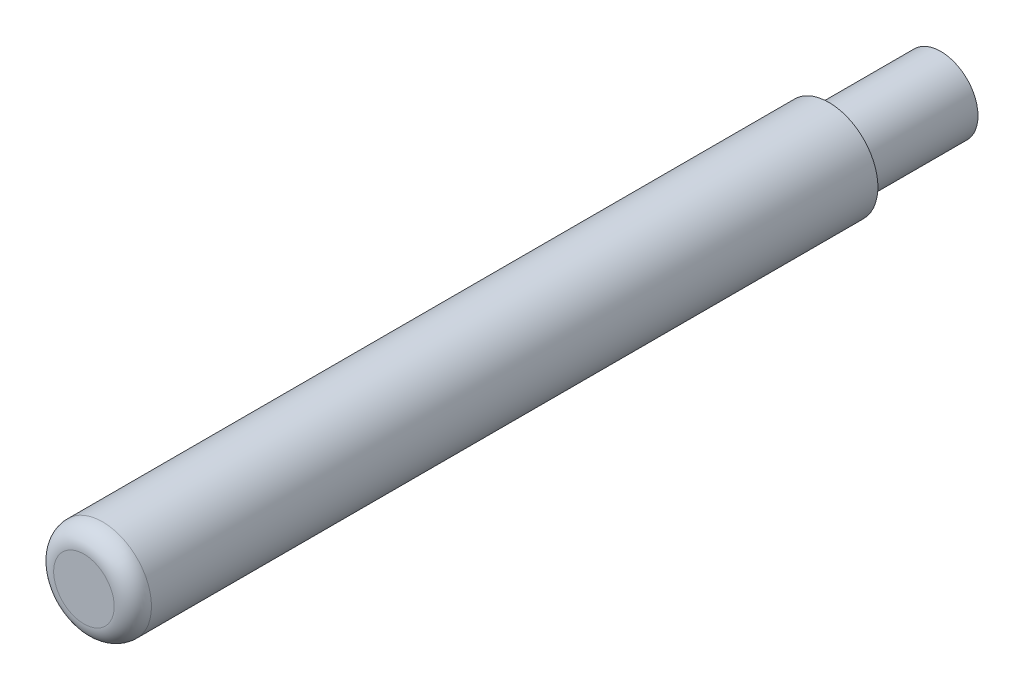
ISO-10303-21;
HEADER;
FILE_DESCRIPTION(('STEP AP214'),'2;1');
FILE_NAME('part.step','',(''),(''),'','','');
FILE_SCHEMA(('AUTOMOTIVE_DESIGN { 1 0 10303 214 1 1 1 1 }'));
ENDSEC;
DATA;
#1=APPLICATION_CONTEXT('core data for automotive mechanical design processes');
#2=APPLICATION_PROTOCOL_DEFINITION('international standard','automotive_design',2000,#1);
#3=PRODUCT_CONTEXT('',#1,'mechanical');
#4=PRODUCT('Part','Part','',(#3));
#5=PRODUCT_RELATED_PRODUCT_CATEGORY('part','',(#4));
#6=PRODUCT_DEFINITION_FORMATION('','',#4);
#7=PRODUCT_DEFINITION_CONTEXT('part definition',#1,'design');
#8=PRODUCT_DEFINITION('design','',#6,#7);
#9=PRODUCT_DEFINITION_SHAPE('','',#8);
#10=(LENGTH_UNIT() NAMED_UNIT(*) SI_UNIT(.MILLI.,.METRE.));
#11=(NAMED_UNIT(*) PLANE_ANGLE_UNIT() SI_UNIT($,.RADIAN.));
#12=(NAMED_UNIT(*) SI_UNIT($,.STERADIAN.) SOLID_ANGLE_UNIT());
#13=UNCERTAINTY_MEASURE_WITH_UNIT(LENGTH_MEASURE(1.E-05),#10,'distance_accuracy_value','');
#14=(GEOMETRIC_REPRESENTATION_CONTEXT(3) GLOBAL_UNCERTAINTY_ASSIGNED_CONTEXT((#13)) GLOBAL_UNIT_ASSIGNED_CONTEXT((#10,
#11,#12)) REPRESENTATION_CONTEXT('',''));
#15=CARTESIAN_POINT('',(0.,0.,0.));
#16=DIRECTION('',(0.,0.,1.));
#17=DIRECTION('',(1.,0.,0.));
#18=AXIS2_PLACEMENT_3D('',#15,#16,#17);
#19=CARTESIAN_POINT('',(0.,0.,-15.24));
#20=DIRECTION('',(0.,0.,1.));
#21=DIRECTION('',(1.,0.,0.));
#22=AXIS2_PLACEMENT_3D('',#19,#20,#21);
#23=CYLINDRICAL_SURFACE('',#22,5.08);
#24=CARTESIAN_POINT('',(0.,0.,-15.24));
#25=DIRECTION('',(0.,0.,1.));
#26=DIRECTION('',(1.,0.,0.));
#27=AXIS2_PLACEMENT_3D('',#24,#25,#26);
#28=CIRCLE('',#27,5.08);
#29=CARTESIAN_POINT('',(5.08,0.,-15.24));
#30=VERTEX_POINT('',#29);
#31=EDGE_CURVE('E57',#30,#30,#28,.T.);
#32=CARTESIAN_POINT('',(0.,0.,0.));
#33=DIRECTION('',(0.,0.,1.));
#34=DIRECTION('',(1.,0.,0.));
#35=AXIS2_PLACEMENT_3D('',#32,#33,#34);
#36=CIRCLE('',#35,5.08);
#37=CARTESIAN_POINT('',(5.08,0.,0.));
#38=VERTEX_POINT('',#37);
#39=EDGE_CURVE('E61',#38,#38,#36,.T.);
#40=CARTESIAN_POINT('',(5.08,0.,-15.24));
#41=CARTESIAN_POINT('',(5.08,0.,-15.08125));
#42=CARTESIAN_POINT('',(5.08,0.,-14.9225));
#43=CARTESIAN_POINT('',(5.08,0.,-14.605));
#44=CARTESIAN_POINT('',(5.08,0.,-14.44625));
#45=CARTESIAN_POINT('',(5.08,0.,-14.12875));
#46=CARTESIAN_POINT('',(5.08,0.,-13.97));
#47=CARTESIAN_POINT('',(5.08,0.,-13.6525));
#48=CARTESIAN_POINT('',(5.08,0.,-13.49375));
#49=CARTESIAN_POINT('',(5.08,0.,-13.17625));
#50=CARTESIAN_POINT('',(5.08,0.,-13.0175));
#51=CARTESIAN_POINT('',(5.08,0.,-12.7));
#52=CARTESIAN_POINT('',(5.08,0.,-12.54125));
#53=CARTESIAN_POINT('',(5.08,0.,-12.22375));
#54=CARTESIAN_POINT('',(5.08,0.,-12.065));
#55=CARTESIAN_POINT('',(5.08,0.,-11.7475));
#56=CARTESIAN_POINT('',(5.08,0.,-11.58875));
#57=CARTESIAN_POINT('',(5.08,0.,-11.27125));
#58=CARTESIAN_POINT('',(5.08,0.,-11.1125));
#59=CARTESIAN_POINT('',(5.08,0.,-10.795));
#60=CARTESIAN_POINT('',(5.08,0.,-10.63625));
#61=CARTESIAN_POINT('',(5.08,0.,-10.31875));
#62=CARTESIAN_POINT('',(5.08,0.,-10.16));
#63=CARTESIAN_POINT('',(5.08,0.,-9.8425));
#64=CARTESIAN_POINT('',(5.08,0.,-9.68375));
#65=CARTESIAN_POINT('',(5.08,0.,-9.36625));
#66=CARTESIAN_POINT('',(5.08,0.,-9.2075));
#67=CARTESIAN_POINT('',(5.08,0.,-8.89));
#68=CARTESIAN_POINT('',(5.08,0.,-8.73125));
#69=CARTESIAN_POINT('',(5.08,0.,-8.41375));
#70=CARTESIAN_POINT('',(5.08,0.,-8.255));
#71=CARTESIAN_POINT('',(5.08,0.,-7.9375));
#72=CARTESIAN_POINT('',(5.08,0.,-7.77875));
#73=CARTESIAN_POINT('',(5.08,0.,-7.46125));
#74=CARTESIAN_POINT('',(5.08,0.,-7.3025));
#75=CARTESIAN_POINT('',(5.08,0.,-6.985));
#76=CARTESIAN_POINT('',(5.08,0.,-6.82625));
#77=CARTESIAN_POINT('',(5.08,0.,-6.50875));
#78=CARTESIAN_POINT('',(5.08,0.,-6.35));
#79=CARTESIAN_POINT('',(5.08,0.,-6.0325));
#80=CARTESIAN_POINT('',(5.08,0.,-5.87375));
#81=CARTESIAN_POINT('',(5.08,0.,-5.55625));
#82=CARTESIAN_POINT('',(5.08,0.,-5.3975));
#83=CARTESIAN_POINT('',(5.08,0.,-5.08));
#84=CARTESIAN_POINT('',(5.08,0.,-4.92125));
#85=CARTESIAN_POINT('',(5.08,0.,-4.60375));
#86=CARTESIAN_POINT('',(5.08,0.,-4.445));
#87=CARTESIAN_POINT('',(5.08,0.,-4.1275));
#88=CARTESIAN_POINT('',(5.08,0.,-3.96875));
#89=CARTESIAN_POINT('',(5.08,0.,-3.65125));
#90=CARTESIAN_POINT('',(5.08,0.,-3.4925));
#91=CARTESIAN_POINT('',(5.08,0.,-3.175));
#92=CARTESIAN_POINT('',(5.08,0.,-3.01625));
#93=CARTESIAN_POINT('',(5.08,0.,-2.69875));
#94=CARTESIAN_POINT('',(5.08,0.,-2.54));
#95=CARTESIAN_POINT('',(5.08,0.,-2.2225));
#96=CARTESIAN_POINT('',(5.08,0.,-2.06375));
#97=CARTESIAN_POINT('',(5.08,0.,-1.74625));
#98=CARTESIAN_POINT('',(5.08,0.,-1.5875));
#99=CARTESIAN_POINT('',(5.08,0.,-1.27));
#100=CARTESIAN_POINT('',(5.08,0.,-1.11125));
#101=CARTESIAN_POINT('',(5.08,0.,-0.793750000000001));
#102=CARTESIAN_POINT('',(5.08,0.,-0.635000000000001));
#103=CARTESIAN_POINT('',(5.08,0.,-0.317500000000001));
#104=CARTESIAN_POINT('',(5.08,0.,-0.15875));
#105=CARTESIAN_POINT('',(5.08,0.,0.));
#106=B_SPLINE_CURVE_WITH_KNOTS('',3,(#40,#41,#42,#43,#44,#45,#46,#47,#48,#49,#50,#51,#52,#53,
#54,#55,#56,#57,#58,#59,#60,#61,#62,#63,#64,#65,#66,#67,#68,#69,#70,#71,#72,#73,#74,#75,#76,#77,
#78,#79,#80,#81,#82,#83,#84,#85,#86,#87,#88,#89,#90,#91,#92,#93,#94,#95,#96,#97,#98,#99,#100,
#101,#102,#103,#104,#105),.UNSPECIFIED.,.F.,.F.,(4,2,2,2,2,2,2,2,2,2,2,2,2,2,2,2,2,2,2,2,2,2,2,
2,2,2,2,2,2,2,2,2,4),(0.,0.476250000000001,0.952500000000002,1.42875,1.905,2.38125,2.8575,
3.33375,3.81,4.28625,4.7625,5.23875,5.715,6.19125,6.6675,7.14375,7.62,8.09625,8.5725,9.04875,
9.525,10.00125,10.4775,10.95375,11.43,11.90625,12.3825,12.85875,13.335,13.81125,14.2875,
14.76375,15.24),.UNSPECIFIED.);
#107=EDGE_CURVE('BSEAM46',#30,#38,#106,.T.);
#108=ORIENTED_EDGE('',*,*,#31,.T.);
#109=ORIENTED_EDGE('',*,*,#39,.F.);
#110=ORIENTED_EDGE('',*,*,#107,.T.);
#111=ORIENTED_EDGE('',*,*,#107,.F.);
#112=EDGE_LOOP('',(#108,#110,#109,#111));
#113=FACE_BOUND('',#112,.T.);
#114=ADVANCED_FACE('F46',(#113),#23,.T.);
#115=CARTESIAN_POINT('',(0.,0.,-15.24));
#116=DIRECTION('',(0.,0.,1.));
#117=DIRECTION('',(1.,0.,0.));
#118=AXIS2_PLACEMENT_3D('',#115,#116,#117);
#119=PLANE('',#118);
#120=ORIENTED_EDGE('',*,*,#31,.F.);
#121=EDGE_LOOP('',(#120));
#122=FACE_BOUND('',#121,.T.);
#123=ADVANCED_FACE('F85',(#122),#119,.F.);
#124=CARTESIAN_POINT('',(0.,0.,101.6));
#125=DIRECTION('',(0.,0.,-1.));
#126=DIRECTION('',(-1.,0.,0.));
#127=AXIS2_PLACEMENT_3D('',#124,#125,#126);
#128=CYLINDRICAL_SURFACE('',#127,6.6675);
#129=CARTESIAN_POINT('',(0.,0.,99.06));
#130=DIRECTION('',(0.,0.,1.));
#131=DIRECTION('',(1.,0.,0.));
#132=AXIS2_PLACEMENT_3D('',#129,#130,#131);
#133=CIRCLE('',#132,6.6675);
#134=CARTESIAN_POINT('',(-6.6675,0.,99.06));
#135=VERTEX_POINT('',#134);
#136=EDGE_CURVE('E12',#135,#135,#133,.F.);
#137=CARTESIAN_POINT('',(0.,0.,0.));
#138=DIRECTION('',(0.,0.,1.));
#139=DIRECTION('',(1.,0.,0.));
#140=AXIS2_PLACEMENT_3D('',#137,#138,#139);
#141=CIRCLE('',#140,6.6675);
#142=CARTESIAN_POINT('',(-6.6675,0.,0.));
#143=VERTEX_POINT('',#142);
#144=EDGE_CURVE('E65',#143,#143,#141,.T.);
#145=CARTESIAN_POINT('',(-6.6675,0.,99.06));
#146=CARTESIAN_POINT('',(-6.6675,0.,98.028125));
#147=CARTESIAN_POINT('',(-6.6675,0.,96.99625));
#148=CARTESIAN_POINT('',(-6.6675,0.,94.9325));
#149=CARTESIAN_POINT('',(-6.6675,0.,93.900625));
#150=CARTESIAN_POINT('',(-6.6675,0.,91.836875));
#151=CARTESIAN_POINT('',(-6.6675,0.,90.805));
#152=CARTESIAN_POINT('',(-6.6675,0.,88.74125));
#153=CARTESIAN_POINT('',(-6.6675,0.,87.709375));
#154=CARTESIAN_POINT('',(-6.6675,0.,85.645625));
#155=CARTESIAN_POINT('',(-6.6675,0.,84.61375));
#156=CARTESIAN_POINT('',(-6.6675,0.,82.55));
#157=CARTESIAN_POINT('',(-6.6675,0.,81.518125));
#158=CARTESIAN_POINT('',(-6.6675,0.,79.454375));
#159=CARTESIAN_POINT('',(-6.6675,0.,78.4225));
#160=CARTESIAN_POINT('',(-6.6675,0.,76.35875));
#161=CARTESIAN_POINT('',(-6.6675,0.,75.326875));
#162=CARTESIAN_POINT('',(-6.6675,0.,73.263125));
#163=CARTESIAN_POINT('',(-6.6675,0.,72.23125));
#164=CARTESIAN_POINT('',(-6.6675,0.,70.1675));
#165=CARTESIAN_POINT('',(-6.6675,0.,69.135625));
#166=CARTESIAN_POINT('',(-6.6675,0.,67.071875));
#167=CARTESIAN_POINT('',(-6.6675,0.,66.04));
#168=CARTESIAN_POINT('',(-6.6675,0.,63.97625));
#169=CARTESIAN_POINT('',(-6.6675,0.,62.944375));
#170=CARTESIAN_POINT('',(-6.6675,0.,60.880625));
#171=CARTESIAN_POINT('',(-6.6675,0.,59.84875));
#172=CARTESIAN_POINT('',(-6.6675,0.,57.785));
#173=CARTESIAN_POINT('',(-6.6675,0.,56.753125));
#174=CARTESIAN_POINT('',(-6.6675,0.,54.689375));
#175=CARTESIAN_POINT('',(-6.6675,0.,53.6575));
#176=CARTESIAN_POINT('',(-6.6675,0.,51.59375));
#177=CARTESIAN_POINT('',(-6.6675,0.,50.561875));
#178=CARTESIAN_POINT('',(-6.6675,0.,48.498125));
#179=CARTESIAN_POINT('',(-6.6675,0.,47.46625));
#180=CARTESIAN_POINT('',(-6.6675,0.,45.4025));
#181=CARTESIAN_POINT('',(-6.6675,0.,44.370625));
#182=CARTESIAN_POINT('',(-6.6675,0.,42.306875));
#183=CARTESIAN_POINT('',(-6.6675,0.,41.275));
#184=CARTESIAN_POINT('',(-6.6675,0.,39.21125));
#185=CARTESIAN_POINT('',(-6.6675,0.,38.179375));
#186=CARTESIAN_POINT('',(-6.6675,0.,36.115625));
#187=CARTESIAN_POINT('',(-6.6675,0.,35.08375));
#188=CARTESIAN_POINT('',(-6.6675,0.,33.02));
#189=CARTESIAN_POINT('',(-6.6675,0.,31.988125));
#190=CARTESIAN_POINT('',(-6.6675,0.,29.924375));
#191=CARTESIAN_POINT('',(-6.6675,0.,28.8925));
#192=CARTESIAN_POINT('',(-6.6675,0.,26.82875));
#193=CARTESIAN_POINT('',(-6.6675,0.,25.796875));
#194=CARTESIAN_POINT('',(-6.6675,0.,23.733125));
#195=CARTESIAN_POINT('',(-6.6675,0.,22.70125));
#196=CARTESIAN_POINT('',(-6.6675,0.,20.6375));
#197=CARTESIAN_POINT('',(-6.6675,0.,19.605625));
#198=CARTESIAN_POINT('',(-6.6675,0.,17.541875));
#199=CARTESIAN_POINT('',(-6.6675,0.,16.51));
#200=CARTESIAN_POINT('',(-6.6675,0.,14.44625));
#201=CARTESIAN_POINT('',(-6.6675,0.,13.414375));
#202=CARTESIAN_POINT('',(-6.6675,0.,11.350625));
#203=CARTESIAN_POINT('',(-6.6675,0.,10.31875));
#204=CARTESIAN_POINT('',(-6.6675,0.,8.255));
#205=CARTESIAN_POINT('',(-6.6675,0.,7.223125));
#206=CARTESIAN_POINT('',(-6.6675,0.,5.159375));
#207=CARTESIAN_POINT('',(-6.6675,0.,4.1275));
#208=CARTESIAN_POINT('',(-6.6675,0.,2.06375));
#209=CARTESIAN_POINT('',(-6.6675,0.,1.031875));
#210=CARTESIAN_POINT('',(-6.6675,0.,0.));
#211=B_SPLINE_CURVE_WITH_KNOTS('',3,(#145,#146,#147,#148,#149,#150,#151,#152,#153,#154,#155,
#156,#157,#158,#159,#160,#161,#162,#163,#164,#165,#166,#167,#168,#169,#170,#171,#172,#173,#174,
#175,#176,#177,#178,#179,#180,#181,#182,#183,#184,#185,#186,#187,#188,#189,#190,#191,#192,#193,
#194,#195,#196,#197,#198,#199,#200,#201,#202,#203,#204,#205,#206,#207,#208,#209,#210),
.UNSPECIFIED.,.F.,.F.,(4,2,2,2,2,2,2,2,2,2,2,2,2,2,2,2,2,2,2,2,2,2,2,2,2,2,2,2,2,2,2,2,4),(0.,
3.09562499999999,6.19125,9.28687499999999,12.3825,15.478125,18.57375,21.669375,24.765,27.860625,
30.95625,34.051875,37.1475,40.243125,43.33875,46.434375,49.53,52.625625,55.72125,58.816875,
61.9125,65.008125,68.10375,71.199375,74.295,77.390625,80.48625,83.581875,86.6775,89.773125,
92.86875,95.964375,99.06),.UNSPECIFIED.);
#212=EDGE_CURVE('BSEAM70',#135,#143,#211,.T.);
#213=ORIENTED_EDGE('',*,*,#136,.T.);
#214=ORIENTED_EDGE('',*,*,#144,.T.);
#215=ORIENTED_EDGE('',*,*,#212,.T.);
#216=ORIENTED_EDGE('',*,*,#212,.F.);
#217=EDGE_LOOP('',(#213,#215,#214,#216));
#218=FACE_BOUND('',#217,.T.);
#219=ADVANCED_FACE('F70',(#218),#128,.T.);
#220=CARTESIAN_POINT('',(0.,0.,101.6));
#221=DIRECTION('',(0.,0.,1.));
#222=DIRECTION('',(1.,0.,0.));
#223=AXIS2_PLACEMENT_3D('',#220,#221,#222);
#224=PLANE('',#223);
#225=CARTESIAN_POINT('',(0.,0.,101.6));
#226=DIRECTION('',(0.,0.,1.));
#227=DIRECTION('',(1.,0.,0.));
#228=AXIS2_PLACEMENT_3D('',#225,#226,#227);
#229=CIRCLE('',#228,4.1275);
#230=CARTESIAN_POINT('',(4.1275,0.,101.6));
#231=VERTEX_POINT('',#230);
#232=EDGE_CURVE('E53',#231,#231,#229,.T.);
#233=ORIENTED_EDGE('',*,*,#232,.T.);
#234=EDGE_LOOP('',(#233));
#235=FACE_BOUND('',#234,.T.);
#236=ADVANCED_FACE('F74',(#235),#224,.T.);
#237=CARTESIAN_POINT('',(0.,0.,0.));
#238=DIRECTION('',(0.,0.,1.));
#239=DIRECTION('',(1.,0.,0.));
#240=AXIS2_PLACEMENT_3D('',#237,#238,#239);
#241=PLANE('',#240);
#242=ORIENTED_EDGE('',*,*,#39,.T.);
#243=EDGE_LOOP('',(#242));
#244=FACE_BOUND('',#243,.T.);
#245=ORIENTED_EDGE('',*,*,#144,.F.);
#246=EDGE_LOOP('',(#245));
#247=FACE_BOUND('',#246,.T.);
#248=ADVANCED_FACE('F72',(#244,#247),#241,.F.);
#249=CARTESIAN_POINT('',(0.,0.,99.06));
#250=DIRECTION('',(0.,0.,1.));
#251=DIRECTION('',(1.,0.,0.));
#252=AXIS2_PLACEMENT_3D('',#249,#250,#251);
#253=TOROIDAL_SURFACE('',#252,4.1275,2.54);
#254=ORIENTED_EDGE('',*,*,#136,.F.);
#255=EDGE_LOOP('',(#254));
#256=FACE_BOUND('',#255,.T.);
#257=ORIENTED_EDGE('',*,*,#232,.F.);
#258=EDGE_LOOP('',(#257));
#259=FACE_BOUND('',#258,.T.);
#260=ADVANCED_FACE('F48',(#256,#259),#253,.T.);
#261=CLOSED_SHELL('',(#114,#123,#219,#236,#248,#260));
#262=MANIFOLD_SOLID_BREP('B2',#261);
#263=ADVANCED_BREP_SHAPE_REPRESENTATION('',(#18,#262),#14);
#264=SHAPE_DEFINITION_REPRESENTATION(#9,#263);
ENDSEC;
END-ISO-10303-21;
